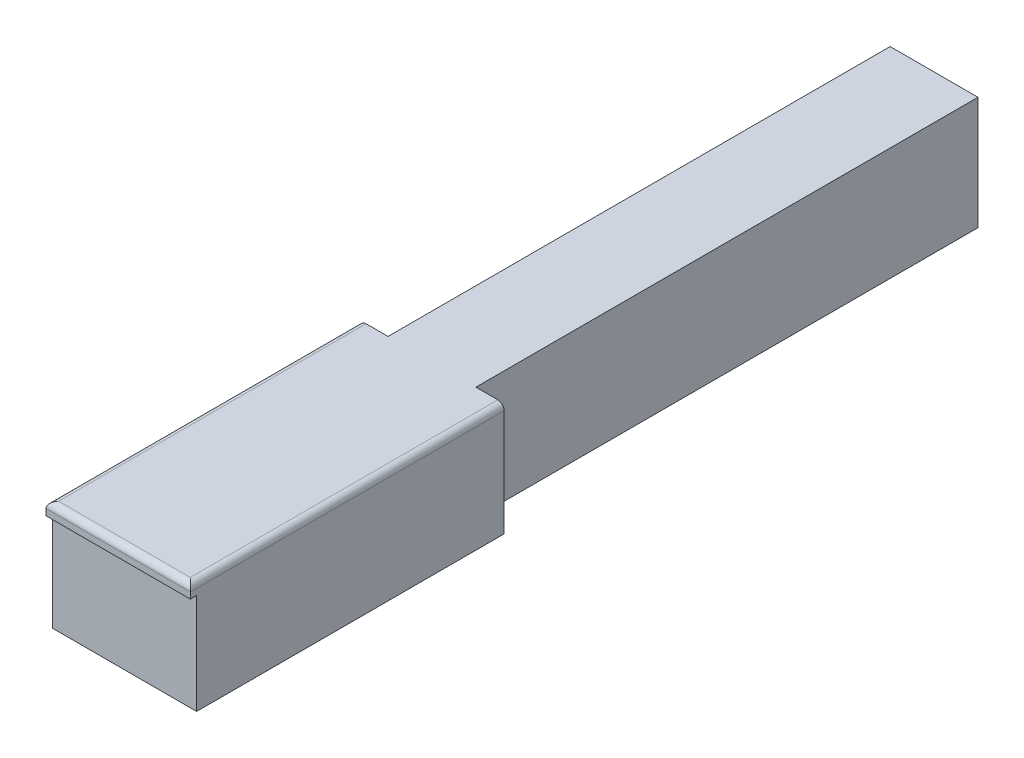
ISO-10303-21;
HEADER;
FILE_DESCRIPTION(('STEP AP214'),'2;1');
FILE_NAME('part.step','',(''),(''),'','','');
FILE_SCHEMA(('AUTOMOTIVE_DESIGN { 1 0 10303 214 1 1 1 1 }'));
ENDSEC;
DATA;
#1=APPLICATION_CONTEXT('core data for automotive mechanical design processes');
#2=APPLICATION_PROTOCOL_DEFINITION('international standard','automotive_design',2000,#1);
#3=PRODUCT_CONTEXT('',#1,'mechanical');
#4=PRODUCT('Part','Part','',(#3));
#5=PRODUCT_RELATED_PRODUCT_CATEGORY('part','',(#4));
#6=PRODUCT_DEFINITION_FORMATION('','',#4);
#7=PRODUCT_DEFINITION_CONTEXT('part definition',#1,'design');
#8=PRODUCT_DEFINITION('design','',#6,#7);
#9=PRODUCT_DEFINITION_SHAPE('','',#8);
#10=(LENGTH_UNIT() NAMED_UNIT(*) SI_UNIT(.MILLI.,.METRE.));
#11=(NAMED_UNIT(*) PLANE_ANGLE_UNIT() SI_UNIT($,.RADIAN.));
#12=(NAMED_UNIT(*) SI_UNIT($,.STERADIAN.) SOLID_ANGLE_UNIT());
#13=UNCERTAINTY_MEASURE_WITH_UNIT(LENGTH_MEASURE(1.E-05),#10,'distance_accuracy_value','');
#14=(GEOMETRIC_REPRESENTATION_CONTEXT(3) GLOBAL_UNCERTAINTY_ASSIGNED_CONTEXT((#13)) GLOBAL_UNIT_ASSIGNED_CONTEXT((#10,
#11,#12)) REPRESENTATION_CONTEXT('',''));
#15=CARTESIAN_POINT('',(0.,0.,0.));
#16=DIRECTION('',(0.,0.,1.));
#17=DIRECTION('',(1.,0.,0.));
#18=AXIS2_PLACEMENT_3D('',#15,#16,#17);
#19=CARTESIAN_POINT('',(0.,18.,-130.));
#20=DIRECTION('',(0.,0.,-1.));
#21=DIRECTION('',(-1.,0.,0.));
#22=AXIS2_PLACEMENT_3D('',#19,#20,#21);
#23=PLANE('',#22);
#24=DIRECTION('',(1.,0.,0.));
#25=VECTOR('',#24,1.);
#26=CARTESIAN_POINT('',(0.,0.,-130.));
#27=LINE('',#26,#25);
#28=CARTESIAN_POINT('',(4.5,0.,-130.));
#29=VERTEX_POINT('',#28);
#30=CARTESIAN_POINT('',(18.5,0.,-130.));
#31=VERTEX_POINT('',#30);
#32=EDGE_CURVE('E213',#29,#31,#27,.T.);
#33=ORIENTED_EDGE('',*,*,#32,.F.);
#34=DIRECTION('',(0.,-1.,0.));
#35=VECTOR('',#34,1.);
#36=CARTESIAN_POINT('',(4.5,18.,-130.));
#37=LINE('',#36,#35);
#38=CARTESIAN_POINT('',(4.5,18.,-130.));
#39=VERTEX_POINT('',#38);
#40=EDGE_CURVE('E177',#39,#29,#37,.T.);
#41=ORIENTED_EDGE('',*,*,#40,.F.);
#42=DIRECTION('',(1.,0.,0.));
#43=VECTOR('',#42,1.);
#44=CARTESIAN_POINT('',(0.,18.,-130.));
#45=LINE('',#44,#43);
#46=CARTESIAN_POINT('',(18.5,18.,-130.));
#47=VERTEX_POINT('',#46);
#48=EDGE_CURVE('E161',#39,#47,#45,.T.);
#49=ORIENTED_EDGE('',*,*,#48,.T.);
#50=DIRECTION('',(0.,-1.,0.));
#51=VECTOR('',#50,1.);
#52=CARTESIAN_POINT('',(18.5,18.,-130.));
#53=LINE('',#52,#51);
#54=EDGE_CURVE('E162',#47,#31,#53,.T.);
#55=ORIENTED_EDGE('',*,*,#54,.T.);
#56=EDGE_LOOP('',(#33,#41,#49,#55));
#57=FACE_BOUND('',#56,.T.);
#58=ADVANCED_FACE('F37',(#57),#23,.T.);
#59=CARTESIAN_POINT('',(4.50000000000002,18.,0.));
#60=DIRECTION('',(1.,0.,0.));
#61=DIRECTION('',(0.,0.,-1.));
#62=AXIS2_PLACEMENT_3D('',#59,#60,#61);
#63=PLANE('',#62);
#64=DIRECTION('',(0.,0.,1.));
#65=VECTOR('',#64,1.);
#66=CARTESIAN_POINT('',(4.50000000000002,0.,0.));
#67=LINE('',#66,#65);
#68=CARTESIAN_POINT('',(4.50000000000001,0.,-50.));
#69=VERTEX_POINT('',#68);
#70=EDGE_CURVE('E228',#29,#69,#67,.T.);
#71=ORIENTED_EDGE('',*,*,#70,.T.);
#72=DIRECTION('',(0.,-1.,0.));
#73=VECTOR('',#72,1.);
#74=CARTESIAN_POINT('',(4.50000000000001,18.,-50.));
#75=LINE('',#74,#73);
#76=CARTESIAN_POINT('',(4.50000000000001,18.,-50.));
#77=VERTEX_POINT('',#76);
#78=EDGE_CURVE('E175',#77,#69,#75,.T.);
#79=ORIENTED_EDGE('',*,*,#78,.F.);
#80=DIRECTION('',(0.,0.,1.));
#81=VECTOR('',#80,1.);
#82=CARTESIAN_POINT('',(4.50000000000002,18.,0.));
#83=LINE('',#82,#81);
#84=EDGE_CURVE('E217',#39,#77,#83,.T.);
#85=ORIENTED_EDGE('',*,*,#84,.F.);
#86=ORIENTED_EDGE('',*,*,#40,.T.);
#87=EDGE_LOOP('',(#71,#79,#85,#86));
#88=FACE_BOUND('',#87,.T.);
#89=ADVANCED_FACE('F241',(#88),#63,.F.);
#90=CARTESIAN_POINT('',(0.,18.,-50.));
#91=DIRECTION('',(0.,0.,-1.));
#92=DIRECTION('',(-1.,0.,0.));
#93=AXIS2_PLACEMENT_3D('',#90,#91,#92);
#94=PLANE('',#93);
#95=DIRECTION('',(0.,-1.,0.));
#96=VECTOR('',#95,1.);
#97=CARTESIAN_POINT('',(0.,18.,-50.));
#98=LINE('',#97,#96);
#99=CARTESIAN_POINT('',(0.,17.,-50.));
#100=VERTEX_POINT('',#99);
#101=CARTESIAN_POINT('',(0.,0.,-50.));
#102=VERTEX_POINT('',#101);
#103=EDGE_CURVE('E173',#100,#102,#98,.T.);
#104=ORIENTED_EDGE('',*,*,#103,.F.);
#105=CARTESIAN_POINT('',(0.999999999999991,17.,-50.));
#106=DIRECTION('',(0.,0.,-1.));
#107=DIRECTION('',(-1.,0.,0.));
#108=AXIS2_PLACEMENT_3D('',#105,#106,#107);
#109=CIRCLE('',#108,1.);
#110=CARTESIAN_POINT('',(0.999999999999991,18.,-50.));
#111=VERTEX_POINT('',#110);
#112=EDGE_CURVE('E182',#100,#111,#109,.T.);
#113=ORIENTED_EDGE('',*,*,#112,.T.);
#114=DIRECTION('',(1.,0.,0.));
#115=VECTOR('',#114,1.);
#116=CARTESIAN_POINT('',(0.,18.,-50.));
#117=LINE('',#116,#115);
#118=EDGE_CURVE('E220',#111,#77,#117,.T.);
#119=ORIENTED_EDGE('',*,*,#118,.T.);
#120=ORIENTED_EDGE('',*,*,#78,.T.);
#121=DIRECTION('',(1.,0.,0.));
#122=VECTOR('',#121,1.);
#123=CARTESIAN_POINT('',(0.,0.,-50.));
#124=LINE('',#123,#122);
#125=EDGE_CURVE('E156',#102,#69,#124,.T.);
#126=ORIENTED_EDGE('',*,*,#125,.F.);
#127=EDGE_LOOP('',(#104,#113,#119,#120,#126));
#128=FACE_BOUND('',#127,.T.);
#129=ADVANCED_FACE('F236',(#128),#94,.T.);
#130=CARTESIAN_POINT('',(0.,18.,0.));
#131=DIRECTION('',(-1.,0.,0.));
#132=DIRECTION('',(0.,0.,1.));
#133=AXIS2_PLACEMENT_3D('',#130,#131,#132);
#134=PLANE('',#133);
#135=DIRECTION('',(0.,-1.,0.));
#136=VECTOR('',#135,1.);
#137=CARTESIAN_POINT('',(0.,18.,0.));
#138=LINE('',#137,#136);
#139=CARTESIAN_POINT('',(0.,17.,0.));
#140=VERTEX_POINT('',#139);
#141=CARTESIAN_POINT('',(0.,16.,0.));
#142=VERTEX_POINT('',#141);
#143=EDGE_CURVE('E171',#140,#142,#138,.T.);
#144=ORIENTED_EDGE('',*,*,#143,.F.);
#145=DIRECTION('',(0.,0.,-1.));
#146=VECTOR('',#145,1.);
#147=CARTESIAN_POINT('',(0.,17.,0.));
#148=LINE('',#147,#146);
#149=EDGE_CURVE('E179',#140,#100,#148,.T.);
#150=ORIENTED_EDGE('',*,*,#149,.T.);
#151=ORIENTED_EDGE('',*,*,#103,.T.);
#152=DIRECTION('',(0.,0.,-1.));
#153=VECTOR('',#152,1.);
#154=CARTESIAN_POINT('',(0.,0.,0.));
#155=LINE('',#154,#153);
#156=CARTESIAN_POINT('',(0.,0.,-1.));
#157=VERTEX_POINT('',#156);
#158=EDGE_CURVE('E152',#157,#102,#155,.T.);
#159=ORIENTED_EDGE('',*,*,#158,.F.);
#160=DIRECTION('',(0.,-1.,0.));
#161=VECTOR('',#160,1.);
#162=CARTESIAN_POINT('',(0.,0.,-1.));
#163=LINE('',#162,#161);
#164=CARTESIAN_POINT('',(0.,16.,-1.));
#165=VERTEX_POINT('',#164);
#166=EDGE_CURVE('E133',#165,#157,#163,.T.);
#167=ORIENTED_EDGE('',*,*,#166,.F.);
#168=DIRECTION('',(0.,0.,1.));
#169=VECTOR('',#168,1.);
#170=CARTESIAN_POINT('',(0.,16.,-1.));
#171=LINE('',#170,#169);
#172=EDGE_CURVE('E211',#165,#142,#171,.T.);
#173=ORIENTED_EDGE('',*,*,#172,.T.);
#174=EDGE_LOOP('',(#144,#150,#151,#159,#167,#173));
#175=FACE_BOUND('',#174,.T.);
#176=ADVANCED_FACE('F257',(#175),#134,.T.);
#177=CARTESIAN_POINT('',(0.,18.,0.));
#178=DIRECTION('',(0.,0.,-1.));
#179=DIRECTION('',(-1.,0.,0.));
#180=AXIS2_PLACEMENT_3D('',#177,#178,#179);
#181=PLANE('',#180);
#182=DIRECTION('',(0.,-1.,0.));
#183=VECTOR('',#182,1.);
#184=CARTESIAN_POINT('',(23.,18.,0.));
#185=LINE('',#184,#183);
#186=CARTESIAN_POINT('',(23.,17.,0.));
#187=VERTEX_POINT('',#186);
#188=CARTESIAN_POINT('',(23.,16.,0.));
#189=VERTEX_POINT('',#188);
#190=EDGE_CURVE('E169',#187,#189,#185,.T.);
#191=ORIENTED_EDGE('',*,*,#190,.F.);
#192=DIRECTION('',(1.,0.,0.));
#193=VECTOR('',#192,1.);
#194=CARTESIAN_POINT('',(0.,17.,0.));
#195=LINE('',#194,#193);
#196=EDGE_CURVE('E11',#187,#140,#195,.F.);
#197=ORIENTED_EDGE('',*,*,#196,.T.);
#198=ORIENTED_EDGE('',*,*,#143,.T.);
#199=DIRECTION('',(-1.,0.,0.));
#200=VECTOR('',#199,1.);
#201=CARTESIAN_POINT('',(0.,16.,0.));
#202=LINE('',#201,#200);
#203=EDGE_CURVE('E198',#189,#142,#202,.T.);
#204=ORIENTED_EDGE('',*,*,#203,.F.);
#205=EDGE_LOOP('',(#191,#197,#198,#204));
#206=FACE_BOUND('',#205,.T.);
#207=ADVANCED_FACE('F255',(#206),#181,.F.);
#208=CARTESIAN_POINT('',(23.,18.,0.));
#209=DIRECTION('',(-1.,0.,0.));
#210=DIRECTION('',(0.,0.,1.));
#211=AXIS2_PLACEMENT_3D('',#208,#209,#210);
#212=PLANE('',#211);
#213=DIRECTION('',(0.,-1.,0.));
#214=VECTOR('',#213,1.);
#215=CARTESIAN_POINT('',(23.,18.,-50.));
#216=LINE('',#215,#214);
#217=CARTESIAN_POINT('',(23.,17.,-50.));
#218=VERTEX_POINT('',#217);
#219=CARTESIAN_POINT('',(23.,0.,-50.));
#220=VERTEX_POINT('',#219);
#221=EDGE_CURVE('E167',#218,#220,#216,.T.);
#222=ORIENTED_EDGE('',*,*,#221,.F.);
#223=DIRECTION('',(0.,0.,-1.));
#224=VECTOR('',#223,1.);
#225=CARTESIAN_POINT('',(23.,17.,0.));
#226=LINE('',#225,#224);
#227=EDGE_CURVE('E46',#218,#187,#226,.F.);
#228=ORIENTED_EDGE('',*,*,#227,.T.);
#229=ORIENTED_EDGE('',*,*,#190,.T.);
#230=DIRECTION('',(0.,0.,1.));
#231=VECTOR('',#230,1.);
#232=CARTESIAN_POINT('',(23.,16.,-1.));
#233=LINE('',#232,#231);
#234=CARTESIAN_POINT('',(23.,16.,-1.));
#235=VERTEX_POINT('',#234);
#236=EDGE_CURVE('E145',#235,#189,#233,.T.);
#237=ORIENTED_EDGE('',*,*,#236,.F.);
#238=DIRECTION('',(0.,1.,0.));
#239=VECTOR('',#238,1.);
#240=CARTESIAN_POINT('',(23.,0.,-1.));
#241=LINE('',#240,#239);
#242=CARTESIAN_POINT('',(23.,0.,-1.));
#243=VERTEX_POINT('',#242);
#244=EDGE_CURVE('E130',#243,#235,#241,.T.);
#245=ORIENTED_EDGE('',*,*,#244,.F.);
#246=DIRECTION('',(0.,0.,-1.));
#247=VECTOR('',#246,1.);
#248=CARTESIAN_POINT('',(23.,0.,0.));
#249=LINE('',#248,#247);
#250=EDGE_CURVE('E142',#243,#220,#249,.T.);
#251=ORIENTED_EDGE('',*,*,#250,.T.);
#252=EDGE_LOOP('',(#222,#228,#229,#237,#245,#251));
#253=FACE_BOUND('',#252,.T.);
#254=ADVANCED_FACE('F141',(#253),#212,.F.);
#255=CARTESIAN_POINT('',(0.,18.,-50.));
#256=DIRECTION('',(0.,0.,1.));
#257=DIRECTION('',(1.,0.,0.));
#258=AXIS2_PLACEMENT_3D('',#255,#256,#257);
#259=PLANE('',#258);
#260=DIRECTION('',(-1.,0.,0.));
#261=VECTOR('',#260,1.);
#262=CARTESIAN_POINT('',(0.,18.,-50.));
#263=LINE('',#262,#261);
#264=CARTESIAN_POINT('',(22.,18.,-50.));
#265=VERTEX_POINT('',#264);
#266=CARTESIAN_POINT('',(18.5,18.,-50.));
#267=VERTEX_POINT('',#266);
#268=EDGE_CURVE('E222',#265,#267,#263,.T.);
#269=ORIENTED_EDGE('',*,*,#268,.F.);
#270=CARTESIAN_POINT('',(22.,17.,-50.));
#271=DIRECTION('',(0.,0.,1.));
#272=DIRECTION('',(1.,0.,0.));
#273=AXIS2_PLACEMENT_3D('',#270,#271,#272);
#274=CIRCLE('',#273,1.);
#275=EDGE_CURVE('E61',#265,#218,#274,.F.);
#276=ORIENTED_EDGE('',*,*,#275,.T.);
#277=ORIENTED_EDGE('',*,*,#221,.T.);
#278=DIRECTION('',(-1.,0.,0.));
#279=VECTOR('',#278,1.);
#280=CARTESIAN_POINT('',(0.,0.,-50.));
#281=LINE('',#280,#279);
#282=CARTESIAN_POINT('',(18.5,0.,-50.));
#283=VERTEX_POINT('',#282);
#284=EDGE_CURVE('E151',#220,#283,#281,.T.);
#285=ORIENTED_EDGE('',*,*,#284,.T.);
#286=DIRECTION('',(0.,-1.,0.));
#287=VECTOR('',#286,1.);
#288=CARTESIAN_POINT('',(18.5,18.,-50.));
#289=LINE('',#288,#287);
#290=EDGE_CURVE('E164',#267,#283,#289,.T.);
#291=ORIENTED_EDGE('',*,*,#290,.F.);
#292=EDGE_LOOP('',(#269,#276,#277,#285,#291));
#293=FACE_BOUND('',#292,.T.);
#294=ADVANCED_FACE('F249',(#293),#259,.F.);
#295=CARTESIAN_POINT('',(18.5,18.,0.));
#296=DIRECTION('',(1.,0.,0.));
#297=DIRECTION('',(0.,0.,-1.));
#298=AXIS2_PLACEMENT_3D('',#295,#296,#297);
#299=PLANE('',#298);
#300=DIRECTION('',(0.,0.,1.));
#301=VECTOR('',#300,1.);
#302=CARTESIAN_POINT('',(18.5,0.,0.));
#303=LINE('',#302,#301);
#304=EDGE_CURVE('E154',#31,#283,#303,.T.);
#305=ORIENTED_EDGE('',*,*,#304,.F.);
#306=ORIENTED_EDGE('',*,*,#54,.F.);
#307=DIRECTION('',(0.,0.,1.));
#308=VECTOR('',#307,1.);
#309=CARTESIAN_POINT('',(18.5,18.,0.));
#310=LINE('',#309,#308);
#311=EDGE_CURVE('E165',#47,#267,#310,.T.);
#312=ORIENTED_EDGE('',*,*,#311,.T.);
#313=ORIENTED_EDGE('',*,*,#290,.T.);
#314=EDGE_LOOP('',(#305,#306,#312,#313));
#315=FACE_BOUND('',#314,.T.);
#316=ADVANCED_FACE('F247',(#315),#299,.T.);
#317=CARTESIAN_POINT('',(0.,18.,0.));
#318=DIRECTION('',(0.,1.,0.));
#319=DIRECTION('',(0.,0.,1.));
#320=AXIS2_PLACEMENT_3D('',#317,#318,#319);
#321=PLANE('',#320);
#322=ORIENTED_EDGE('',*,*,#118,.F.);
#323=DIRECTION('',(0.,0.,-1.));
#324=VECTOR('',#323,1.);
#325=CARTESIAN_POINT('',(1.,18.,0.));
#326=LINE('',#325,#324);
#327=CARTESIAN_POINT('',(1.,18.,-1.));
#328=VERTEX_POINT('',#327);
#329=EDGE_CURVE('E188',#111,#328,#326,.F.);
#330=ORIENTED_EDGE('',*,*,#329,.T.);
#331=DIRECTION('',(1.,0.,0.));
#332=VECTOR('',#331,1.);
#333=CARTESIAN_POINT('',(23.,18.,-1.));
#334=LINE('',#333,#332);
#335=CARTESIAN_POINT('',(22.,18.,-1.));
#336=VERTEX_POINT('',#335);
#337=EDGE_CURVE('E184',#328,#336,#334,.T.);
#338=ORIENTED_EDGE('',*,*,#337,.T.);
#339=DIRECTION('',(0.,0.,-1.));
#340=VECTOR('',#339,1.);
#341=CARTESIAN_POINT('',(22.,18.,-50.));
#342=LINE('',#341,#340);
#343=EDGE_CURVE('E186',#336,#265,#342,.T.);
#344=ORIENTED_EDGE('',*,*,#343,.T.);
#345=ORIENTED_EDGE('',*,*,#268,.T.);
#346=ORIENTED_EDGE('',*,*,#311,.F.);
#347=ORIENTED_EDGE('',*,*,#48,.F.);
#348=ORIENTED_EDGE('',*,*,#84,.T.);
#349=EDGE_LOOP('',(#322,#330,#338,#344,#345,#346,#347,#348));
#350=FACE_BOUND('',#349,.T.);
#351=ADVANCED_FACE('F266',(#350),#321,.T.);
#352=CARTESIAN_POINT('',(0.,0.,0.));
#353=DIRECTION('',(0.,1.,0.));
#354=DIRECTION('',(0.,0.,1.));
#355=AXIS2_PLACEMENT_3D('',#352,#353,#354);
#356=PLANE('',#355);
#357=ORIENTED_EDGE('',*,*,#250,.F.);
#358=DIRECTION('',(1.,0.,0.));
#359=VECTOR('',#358,1.);
#360=CARTESIAN_POINT('',(0.,0.,-1.));
#361=LINE('',#360,#359);
#362=EDGE_CURVE('E126',#157,#243,#361,.T.);
#363=ORIENTED_EDGE('',*,*,#362,.F.);
#364=ORIENTED_EDGE('',*,*,#158,.T.);
#365=ORIENTED_EDGE('',*,*,#125,.T.);
#366=ORIENTED_EDGE('',*,*,#70,.F.);
#367=ORIENTED_EDGE('',*,*,#32,.T.);
#368=ORIENTED_EDGE('',*,*,#304,.T.);
#369=ORIENTED_EDGE('',*,*,#284,.F.);
#370=EDGE_LOOP('',(#357,#363,#364,#365,#366,#367,#368,#369));
#371=FACE_BOUND('',#370,.T.);
#372=ADVANCED_FACE('F148',(#371),#356,.F.);
#373=CARTESIAN_POINT('',(0.,16.,-1.));
#374=DIRECTION('',(0.,1.,0.));
#375=DIRECTION('',(0.,0.,1.));
#376=AXIS2_PLACEMENT_3D('',#373,#374,#375);
#377=PLANE('',#376);
#378=ORIENTED_EDGE('',*,*,#203,.T.);
#379=ORIENTED_EDGE('',*,*,#172,.F.);
#380=DIRECTION('',(-1.,0.,0.));
#381=VECTOR('',#380,1.);
#382=CARTESIAN_POINT('',(0.,16.,-1.));
#383=LINE('',#382,#381);
#384=EDGE_CURVE('E146',#235,#165,#383,.T.);
#385=ORIENTED_EDGE('',*,*,#384,.F.);
#386=ORIENTED_EDGE('',*,*,#236,.T.);
#387=EDGE_LOOP('',(#378,#379,#385,#386));
#388=FACE_BOUND('',#387,.T.);
#389=ADVANCED_FACE('F258',(#388),#377,.F.);
#390=CARTESIAN_POINT('',(0.,0.,-1.));
#391=DIRECTION('',(0.,0.,-1.));
#392=DIRECTION('',(-1.,0.,0.));
#393=AXIS2_PLACEMENT_3D('',#390,#391,#392);
#394=PLANE('',#393);
#395=ORIENTED_EDGE('',*,*,#166,.T.);
#396=ORIENTED_EDGE('',*,*,#362,.T.);
#397=ORIENTED_EDGE('',*,*,#244,.T.);
#398=ORIENTED_EDGE('',*,*,#384,.T.);
#399=EDGE_LOOP('',(#395,#396,#397,#398));
#400=FACE_BOUND('',#399,.T.);
#401=ADVANCED_FACE('F128',(#400),#394,.F.);
#402=CARTESIAN_POINT('',(22.,17.,0.));
#403=DIRECTION('',(0.,0.,1.));
#404=DIRECTION('',(1.,0.,0.));
#405=AXIS2_PLACEMENT_3D('',#402,#403,#404);
#406=CYLINDRICAL_SURFACE('',#405,1.);
#407=ORIENTED_EDGE('',*,*,#275,.F.);
#408=ORIENTED_EDGE('',*,*,#343,.F.);
#409=CARTESIAN_POINT('',(22.,17.,-1.));
#410=DIRECTION('',(-0.707106781186547,0.,0.707106781186548));
#411=DIRECTION('',(-0.707106781186548,0.,-0.707106781186547));
#412=AXIS2_PLACEMENT_3D('',#409,#410,#411);
#413=ELLIPSE('',#412,1.4142135623731,1.);
#414=EDGE_CURVE('E41',#187,#336,#413,.T.);
#415=ORIENTED_EDGE('',*,*,#414,.F.);
#416=ORIENTED_EDGE('',*,*,#227,.F.);
#417=EDGE_LOOP('',(#407,#408,#415,#416));
#418=FACE_BOUND('',#417,.T.);
#419=ADVANCED_FACE('F39',(#418),#406,.T.);
#420=CARTESIAN_POINT('',(0.,17.,-1.));
#421=DIRECTION('',(-1.,0.,0.));
#422=DIRECTION('',(0.,0.,1.));
#423=AXIS2_PLACEMENT_3D('',#420,#421,#422);
#424=CYLINDRICAL_SURFACE('',#423,1.);
#425=ORIENTED_EDGE('',*,*,#414,.T.);
#426=ORIENTED_EDGE('',*,*,#337,.F.);
#427=CARTESIAN_POINT('',(1.,17.,-1.));
#428=DIRECTION('',(-0.707106781186548,0.,-0.707106781186547));
#429=DIRECTION('',(-0.707106781186547,0.,0.707106781186548));
#430=AXIS2_PLACEMENT_3D('',#427,#428,#429);
#431=ELLIPSE('',#430,1.41421356237309,1.);
#432=EDGE_CURVE('E191',#140,#328,#431,.T.);
#433=ORIENTED_EDGE('',*,*,#432,.F.);
#434=ORIENTED_EDGE('',*,*,#196,.F.);
#435=EDGE_LOOP('',(#425,#426,#433,#434));
#436=FACE_BOUND('',#435,.T.);
#437=ADVANCED_FACE('F252',(#436),#424,.T.);
#438=CARTESIAN_POINT('',(1.,17.,0.));
#439=DIRECTION('',(0.,0.,-1.));
#440=DIRECTION('',(-1.,0.,0.));
#441=AXIS2_PLACEMENT_3D('',#438,#439,#440);
#442=CYLINDRICAL_SURFACE('',#441,1.);
#443=ORIENTED_EDGE('',*,*,#432,.T.);
#444=ORIENTED_EDGE('',*,*,#329,.F.);
#445=ORIENTED_EDGE('',*,*,#112,.F.);
#446=ORIENTED_EDGE('',*,*,#149,.F.);
#447=EDGE_LOOP('',(#443,#444,#445,#446));
#448=FACE_BOUND('',#447,.T.);
#449=ADVANCED_FACE('F277',(#448),#442,.T.);
#450=CLOSED_SHELL('',(#58,#89,#129,#176,#207,#254,#294,#316,#351,#372,#389,#401,#419,#437,#449));
#451=MANIFOLD_SOLID_BREP('B2',#450);
#452=ADVANCED_BREP_SHAPE_REPRESENTATION('',(#18,#451),#14);
#453=SHAPE_DEFINITION_REPRESENTATION(#9,#452);
ENDSEC;
END-ISO-10303-21;
